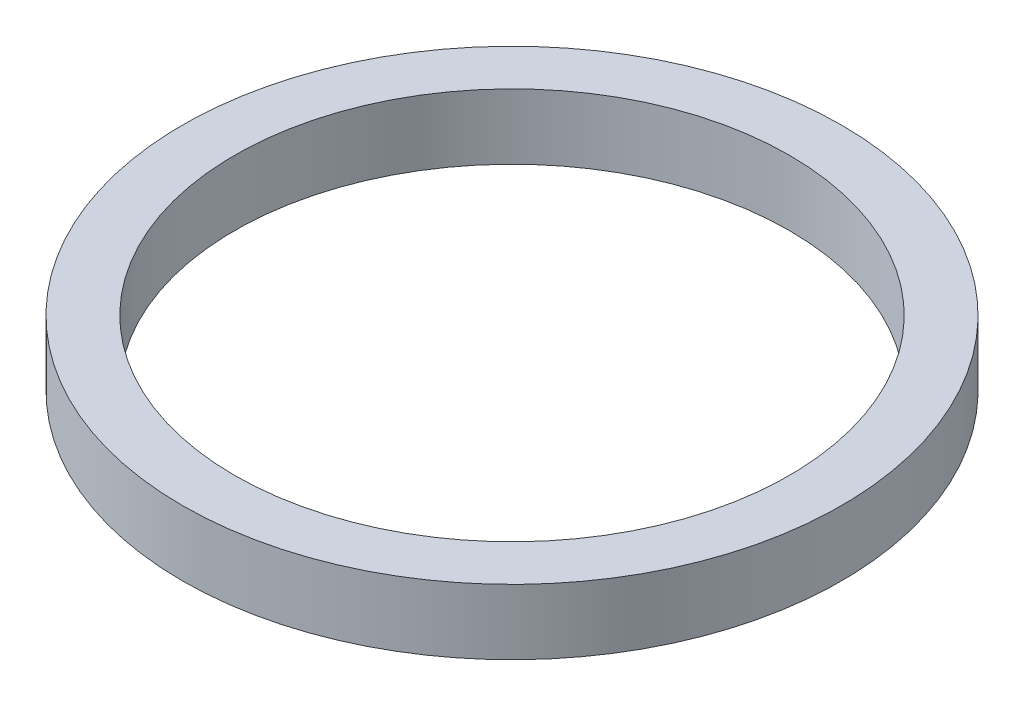
ISO-10303-21;
HEADER;
FILE_DESCRIPTION(('STEP AP214'),'2;1');
FILE_NAME('part.step','',(''),(''),'','','');
FILE_SCHEMA(('AUTOMOTIVE_DESIGN { 1 0 10303 214 1 1 1 1 }'));
ENDSEC;
DATA;
#1=APPLICATION_CONTEXT('core data for automotive mechanical design processes');
#2=APPLICATION_PROTOCOL_DEFINITION('international standard','automotive_design',2000,#1);
#3=PRODUCT_CONTEXT('',#1,'mechanical');
#4=PRODUCT('Part','Part','',(#3));
#5=PRODUCT_RELATED_PRODUCT_CATEGORY('part','',(#4));
#6=PRODUCT_DEFINITION_FORMATION('','',#4);
#7=PRODUCT_DEFINITION_CONTEXT('part definition',#1,'design');
#8=PRODUCT_DEFINITION('design','',#6,#7);
#9=PRODUCT_DEFINITION_SHAPE('','',#8);
#10=(LENGTH_UNIT() NAMED_UNIT(*) SI_UNIT(.MILLI.,.METRE.));
#11=(NAMED_UNIT(*) PLANE_ANGLE_UNIT() SI_UNIT($,.RADIAN.));
#12=(NAMED_UNIT(*) SI_UNIT($,.STERADIAN.) SOLID_ANGLE_UNIT());
#13=UNCERTAINTY_MEASURE_WITH_UNIT(LENGTH_MEASURE(1.E-05),#10,'distance_accuracy_value','');
#14=(GEOMETRIC_REPRESENTATION_CONTEXT(3) GLOBAL_UNCERTAINTY_ASSIGNED_CONTEXT((#13)) GLOBAL_UNIT_ASSIGNED_CONTEXT((#10,
#11,#12)) REPRESENTATION_CONTEXT('',''));
#15=CARTESIAN_POINT('',(0.,0.,0.));
#16=DIRECTION('',(0.,0.,1.));
#17=DIRECTION('',(1.,0.,0.));
#18=AXIS2_PLACEMENT_3D('',#15,#16,#17);
#19=CARTESIAN_POINT('',(0.,5.,0.));
#20=DIRECTION('',(0.,1.,0.));
#21=DIRECTION('',(0.,0.,1.));
#22=AXIS2_PLACEMENT_3D('',#19,#20,#21);
#23=PLANE('',#22);
#24=CARTESIAN_POINT('',(0.,5.,0.));
#25=DIRECTION('',(0.,1.,0.));
#26=DIRECTION('',(0.,0.,1.));
#27=AXIS2_PLACEMENT_3D('',#24,#25,#26);
#28=CIRCLE('',#27,25.25);
#29=CARTESIAN_POINT('',(0.,5.,25.25));
#30=VERTEX_POINT('',#29);
#31=EDGE_CURVE('E10',#30,#30,#28,.T.);
#32=ORIENTED_EDGE('',*,*,#31,.T.);
#33=EDGE_LOOP('',(#32));
#34=FACE_BOUND('',#33,.T.);
#35=CARTESIAN_POINT('',(0.,5.,0.));
#36=DIRECTION('',(0.,1.,0.));
#37=DIRECTION('',(0.,0.,1.));
#38=AXIS2_PLACEMENT_3D('',#35,#36,#37);
#39=CIRCLE('',#38,21.25);
#40=CARTESIAN_POINT('',(0.,5.,21.25));
#41=VERTEX_POINT('',#40);
#42=EDGE_CURVE('E42',#41,#41,#39,.T.);
#43=ORIENTED_EDGE('',*,*,#42,.F.);
#44=EDGE_LOOP('',(#43));
#45=FACE_BOUND('',#44,.T.);
#46=ADVANCED_FACE('F31',(#34,#45),#23,.T.);
#47=CARTESIAN_POINT('',(0.,0.,0.));
#48=DIRECTION('',(0.,1.,0.));
#49=DIRECTION('',(0.,0.,1.));
#50=AXIS2_PLACEMENT_3D('',#47,#48,#49);
#51=PLANE('',#50);
#52=CARTESIAN_POINT('',(0.,0.,0.));
#53=DIRECTION('',(0.,1.,0.));
#54=DIRECTION('',(0.,0.,1.));
#55=AXIS2_PLACEMENT_3D('',#52,#53,#54);
#56=CIRCLE('',#55,25.25);
#57=CARTESIAN_POINT('',(0.,0.,25.25));
#58=VERTEX_POINT('',#57);
#59=EDGE_CURVE('E35',#58,#58,#56,.T.);
#60=ORIENTED_EDGE('',*,*,#59,.F.);
#61=EDGE_LOOP('',(#60));
#62=FACE_BOUND('',#61,.T.);
#63=CARTESIAN_POINT('',(0.,0.,0.));
#64=DIRECTION('',(0.,1.,0.));
#65=DIRECTION('',(0.,0.,1.));
#66=AXIS2_PLACEMENT_3D('',#63,#64,#65);
#67=CIRCLE('',#66,21.25);
#68=CARTESIAN_POINT('',(0.,0.,21.25));
#69=VERTEX_POINT('',#68);
#70=EDGE_CURVE('E44',#69,#69,#67,.T.);
#71=ORIENTED_EDGE('',*,*,#70,.T.);
#72=EDGE_LOOP('',(#71));
#73=FACE_BOUND('',#72,.T.);
#74=ADVANCED_FACE('F54',(#62,#73),#51,.F.);
#75=CARTESIAN_POINT('',(0.,5.,0.));
#76=DIRECTION('',(0.,-1.,0.));
#77=DIRECTION('',(0.,0.,-1.));
#78=AXIS2_PLACEMENT_3D('',#75,#76,#77);
#79=CYLINDRICAL_SURFACE('',#78,25.25);
#80=ORIENTED_EDGE('',*,*,#31,.F.);
#81=EDGE_LOOP('',(#80));
#82=FACE_BOUND('',#81,.T.);
#83=ORIENTED_EDGE('',*,*,#59,.T.);
#84=EDGE_LOOP('',(#83));
#85=FACE_BOUND('',#84,.T.);
#86=ADVANCED_FACE('F33',(#82,#85),#79,.T.);
#87=CARTESIAN_POINT('',(0.,5.,0.));
#88=DIRECTION('',(0.,-1.,0.));
#89=DIRECTION('',(0.,0.,-1.));
#90=AXIS2_PLACEMENT_3D('',#87,#88,#89);
#91=CYLINDRICAL_SURFACE('',#90,21.25);
#92=ORIENTED_EDGE('',*,*,#42,.T.);
#93=EDGE_LOOP('',(#92));
#94=FACE_BOUND('',#93,.T.);
#95=ORIENTED_EDGE('',*,*,#70,.F.);
#96=EDGE_LOOP('',(#95));
#97=FACE_BOUND('',#96,.T.);
#98=ADVANCED_FACE('F50',(#94,#97),#91,.F.);
#99=CLOSED_SHELL('',(#46,#74,#86,#98));
#100=MANIFOLD_SOLID_BREP('B2',#99);
#101=ADVANCED_BREP_SHAPE_REPRESENTATION('',(#18,#100),#14);
#102=SHAPE_DEFINITION_REPRESENTATION(#9,#101);
ENDSEC;
END-ISO-10303-21;
